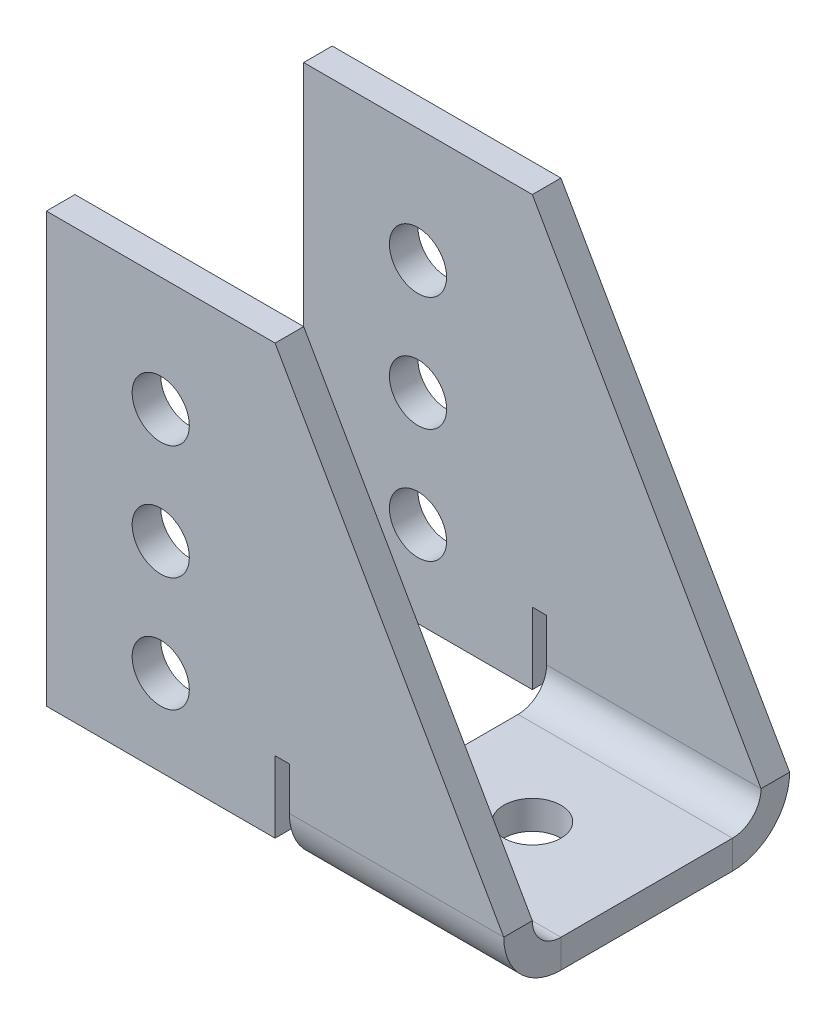
ISO-10303-21;
HEADER;
FILE_DESCRIPTION(('STEP AP214'),'2;1');
FILE_NAME('part.step','',(''),(''),'','','');
FILE_SCHEMA(('AUTOMOTIVE_DESIGN { 1 0 10303 214 1 1 1 1 }'));
ENDSEC;
DATA;
#1=APPLICATION_CONTEXT('core data for automotive mechanical design processes');
#2=APPLICATION_PROTOCOL_DEFINITION('international standard','automotive_design',2000,#1);
#3=PRODUCT_CONTEXT('',#1,'mechanical');
#4=PRODUCT('Part','Part','',(#3));
#5=PRODUCT_RELATED_PRODUCT_CATEGORY('part','',(#4));
#6=PRODUCT_DEFINITION_FORMATION('','',#4);
#7=PRODUCT_DEFINITION_CONTEXT('part definition',#1,'design');
#8=PRODUCT_DEFINITION('design','',#6,#7);
#9=PRODUCT_DEFINITION_SHAPE('','',#8);
#10=(LENGTH_UNIT() NAMED_UNIT(*) SI_UNIT(.MILLI.,.METRE.));
#11=(NAMED_UNIT(*) PLANE_ANGLE_UNIT() SI_UNIT($,.RADIAN.));
#12=(NAMED_UNIT(*) SI_UNIT($,.STERADIAN.) SOLID_ANGLE_UNIT());
#13=UNCERTAINTY_MEASURE_WITH_UNIT(LENGTH_MEASURE(1.E-05),#10,'distance_accuracy_value','');
#14=(GEOMETRIC_REPRESENTATION_CONTEXT(3) GLOBAL_UNCERTAINTY_ASSIGNED_CONTEXT((#13)) GLOBAL_UNIT_ASSIGNED_CONTEXT((#10,
#11,#12)) REPRESENTATION_CONTEXT('',''));
#15=CARTESIAN_POINT('',(0.,0.,0.));
#16=DIRECTION('',(0.,0.,1.));
#17=DIRECTION('',(1.,0.,0.));
#18=AXIS2_PLACEMENT_3D('',#15,#16,#17);
#19=CARTESIAN_POINT('',(50.8,3.175,-25.8868164850226));
#20=DIRECTION('',(1.,0.,0.));
#21=DIRECTION('',(0.,0.,1.));
#22=AXIS2_PLACEMENT_3D('',#19,#20,#21);
#23=PLANE('',#22);
#24=DIRECTION('',(0.,1.,0.));
#25=VECTOR('',#24,1.);
#26=CARTESIAN_POINT('',(50.8,3.175,-3.6618164850226));
#27=LINE('',#26,#25);
#28=CARTESIAN_POINT('',(50.8,0.,-3.6618164850226));
#29=VERTEX_POINT('',#28);
#30=CARTESIAN_POINT('',(50.8,3.175,-3.6618164850226));
#31=VERTEX_POINT('',#30);
#32=EDGE_CURVE('E12',#29,#31,#27,.T.);
#33=ORIENTED_EDGE('',*,*,#32,.F.);
#34=DIRECTION('',(0.,0.,-1.));
#35=VECTOR('',#34,1.);
#36=CARTESIAN_POINT('',(50.8,0.,-25.8868164850226));
#37=LINE('',#36,#35);
#38=CARTESIAN_POINT('',(50.8,0.,-22.7118164850226));
#39=VERTEX_POINT('',#38);
#40=EDGE_CURVE('E158',#39,#29,#37,.F.);
#41=ORIENTED_EDGE('',*,*,#40,.F.);
#42=DIRECTION('',(0.,1.,0.));
#43=VECTOR('',#42,1.);
#44=CARTESIAN_POINT('',(50.8,3.175,-22.7118164850226));
#45=LINE('',#44,#43);
#46=CARTESIAN_POINT('',(50.8,3.175,-22.7118164850226));
#47=VERTEX_POINT('',#46);
#48=EDGE_CURVE('E62',#39,#47,#45,.T.);
#49=ORIENTED_EDGE('',*,*,#48,.T.);
#50=DIRECTION('',(0.,0.,1.));
#51=VECTOR('',#50,1.);
#52=CARTESIAN_POINT('',(50.8,3.175,-25.8868164850226));
#53=LINE('',#52,#51);
#54=EDGE_CURVE('E160',#47,#31,#53,.T.);
#55=ORIENTED_EDGE('',*,*,#54,.T.);
#56=EDGE_LOOP('',(#33,#41,#49,#55));
#57=FACE_BOUND('',#56,.T.);
#58=ADVANCED_FACE('F52',(#57),#23,.T.);
#59=CARTESIAN_POINT('',(50.8,6.35,-22.7118164850226));
#60=DIRECTION('',(-1.,0.,0.));
#61=DIRECTION('',(0.,0.,1.));
#62=AXIS2_PLACEMENT_3D('',#59,#60,#61);
#63=PLANE('',#62);
#64=ORIENTED_EDGE('',*,*,#48,.F.);
#65=CARTESIAN_POINT('',(50.8,6.35,-22.7118164850226));
#66=DIRECTION('',(-1.,0.,0.));
#67=DIRECTION('',(0.,0.,1.));
#68=AXIS2_PLACEMENT_3D('',#65,#66,#67);
#69=CIRCLE('',#68,6.35);
#70=CARTESIAN_POINT('',(50.8,6.35,-29.0618164850226));
#71=VERTEX_POINT('',#70);
#72=EDGE_CURVE('E208',#39,#71,#69,.F.);
#73=ORIENTED_EDGE('',*,*,#72,.T.);
#74=DIRECTION('',(0.,0.,1.));
#75=VECTOR('',#74,1.);
#76=CARTESIAN_POINT('',(50.8,6.35,-25.8868164850226));
#77=LINE('',#76,#75);
#78=CARTESIAN_POINT('',(50.8,6.35,-25.8868164850226));
#79=VERTEX_POINT('',#78);
#80=EDGE_CURVE('E484',#71,#79,#77,.T.);
#81=ORIENTED_EDGE('',*,*,#80,.T.);
#82=CARTESIAN_POINT('',(50.8,6.35,-22.7118164850226));
#83=DIRECTION('',(1.,0.,0.));
#84=DIRECTION('',(0.,0.,-1.));
#85=AXIS2_PLACEMENT_3D('',#82,#83,#84);
#86=CIRCLE('',#85,3.175);
#87=EDGE_CURVE('E407',#47,#79,#86,.T.);
#88=ORIENTED_EDGE('',*,*,#87,.F.);
#89=EDGE_LOOP('',(#64,#73,#81,#88));
#90=FACE_BOUND('',#89,.T.);
#91=ADVANCED_FACE('F482',(#90),#63,.F.);
#92=CARTESIAN_POINT('',(41.0307692307692,23.4461538461538,-25.8868164850226));
#93=DIRECTION('',(0.868243142124459,0.496138938356834,0.));
#94=DIRECTION('',(0.496138938356834,-0.868243142124459,0.));
#95=AXIS2_PLACEMENT_3D('',#92,#93,#94);
#96=PLANE('',#95);
#97=ORIENTED_EDGE('',*,*,#80,.F.);
#98=DIRECTION('',(0.496138938356834,-0.868243142124459,0.));
#99=VECTOR('',#98,1.);
#100=CARTESIAN_POINT('',(41.0307692307692,23.4461538461538,-29.0618164850226));
#101=LINE('',#100,#99);
#102=CARTESIAN_POINT('',(25.4,50.8,-29.0618164850226));
#103=VERTEX_POINT('',#102);
#104=EDGE_CURVE('E465',#103,#71,#101,.T.);
#105=ORIENTED_EDGE('',*,*,#104,.F.);
#106=DIRECTION('',(0.,0.,1.));
#107=VECTOR('',#106,1.);
#108=CARTESIAN_POINT('',(25.4,50.8,-25.8868164850226));
#109=LINE('',#108,#107);
#110=CARTESIAN_POINT('',(25.4,50.8,-25.8868164850226));
#111=VERTEX_POINT('',#110);
#112=EDGE_CURVE('E499',#103,#111,#109,.T.);
#113=ORIENTED_EDGE('',*,*,#112,.T.);
#114=DIRECTION('',(0.496138938356834,-0.868243142124459,0.));
#115=VECTOR('',#114,1.);
#116=CARTESIAN_POINT('',(41.0307692307692,23.4461538461538,-25.8868164850226));
#117=LINE('',#116,#115);
#118=EDGE_CURVE('E501',#111,#79,#117,.T.);
#119=ORIENTED_EDGE('',*,*,#118,.T.);
#120=EDGE_LOOP('',(#97,#105,#113,#119));
#121=FACE_BOUND('',#120,.T.);
#122=ADVANCED_FACE('F496',(#121),#96,.T.);
#123=CARTESIAN_POINT('',(0.,50.8,-25.8868164850226));
#124=DIRECTION('',(0.,1.,0.));
#125=DIRECTION('',(1.,0.,0.));
#126=AXIS2_PLACEMENT_3D('',#123,#124,#125);
#127=PLANE('',#126);
#128=ORIENTED_EDGE('',*,*,#112,.F.);
#129=DIRECTION('',(1.,0.,0.));
#130=VECTOR('',#129,1.);
#131=CARTESIAN_POINT('',(0.,50.8,-29.0618164850226));
#132=LINE('',#131,#130);
#133=CARTESIAN_POINT('',(0.,50.8,-29.0618164850226));
#134=VERTEX_POINT('',#133);
#135=EDGE_CURVE('E470',#134,#103,#132,.T.);
#136=ORIENTED_EDGE('',*,*,#135,.F.);
#137=DIRECTION('',(0.,0.,1.));
#138=VECTOR('',#137,1.);
#139=CARTESIAN_POINT('',(0.,50.8,-25.8868164850226));
#140=LINE('',#139,#138);
#141=CARTESIAN_POINT('',(0.,50.8,-25.8868164850226));
#142=VERTEX_POINT('',#141);
#143=EDGE_CURVE('E504',#134,#142,#140,.T.);
#144=ORIENTED_EDGE('',*,*,#143,.T.);
#145=DIRECTION('',(1.,0.,0.));
#146=VECTOR('',#145,1.);
#147=CARTESIAN_POINT('',(0.,50.8,-25.8868164850226));
#148=LINE('',#147,#146);
#149=EDGE_CURVE('E655',#142,#111,#148,.T.);
#150=ORIENTED_EDGE('',*,*,#149,.T.);
#151=EDGE_LOOP('',(#128,#136,#144,#150));
#152=FACE_BOUND('',#151,.T.);
#153=ADVANCED_FACE('F671',(#152),#127,.T.);
#154=CARTESIAN_POINT('',(0.,0.,-25.8868164850226));
#155=DIRECTION('',(-1.,0.,0.));
#156=DIRECTION('',(0.,1.,0.));
#157=AXIS2_PLACEMENT_3D('',#154,#155,#156);
#158=PLANE('',#157);
#159=ORIENTED_EDGE('',*,*,#143,.F.);
#160=DIRECTION('',(0.,-1.,0.));
#161=VECTOR('',#160,1.);
#162=CARTESIAN_POINT('',(0.,0.,-29.0618164850226));
#163=LINE('',#162,#161);
#164=CARTESIAN_POINT('',(0.,3.175,-29.0618164850226));
#165=VERTEX_POINT('',#164);
#166=EDGE_CURVE('E466',#165,#134,#163,.F.);
#167=ORIENTED_EDGE('',*,*,#166,.F.);
#168=DIRECTION('',(0.,0.,1.));
#169=VECTOR('',#168,1.);
#170=CARTESIAN_POINT('',(0.,3.175,-25.8868164850226));
#171=LINE('',#170,#169);
#172=CARTESIAN_POINT('',(0.,3.175,-25.8868164850226));
#173=VERTEX_POINT('',#172);
#174=EDGE_CURVE('E509',#165,#173,#171,.T.);
#175=ORIENTED_EDGE('',*,*,#174,.T.);
#176=DIRECTION('',(0.,1.,0.));
#177=VECTOR('',#176,1.);
#178=CARTESIAN_POINT('',(0.,0.,-25.8868164850226));
#179=LINE('',#178,#177);
#180=EDGE_CURVE('E315',#173,#142,#179,.T.);
#181=ORIENTED_EDGE('',*,*,#180,.T.);
#182=EDGE_LOOP('',(#159,#167,#175,#181));
#183=FACE_BOUND('',#182,.T.);
#184=ADVANCED_FACE('F669',(#183),#158,.T.);
#185=CARTESIAN_POINT('',(0.,3.175,-25.8868164850226));
#186=DIRECTION('',(0.,-1.,0.));
#187=DIRECTION('',(-1.,0.,0.));
#188=AXIS2_PLACEMENT_3D('',#185,#186,#187);
#189=PLANE('',#188);
#190=ORIENTED_EDGE('',*,*,#174,.F.);
#191=DIRECTION('',(1.,0.,0.));
#192=VECTOR('',#191,1.);
#193=CARTESIAN_POINT('',(0.,3.175,-29.0618164850226));
#194=LINE('',#193,#192);
#195=CARTESIAN_POINT('',(25.4,3.175,-29.0618164850226));
#196=VERTEX_POINT('',#195);
#197=EDGE_CURVE('E461',#196,#165,#194,.F.);
#198=ORIENTED_EDGE('',*,*,#197,.F.);
#199=DIRECTION('',(0.,0.,1.));
#200=VECTOR('',#199,1.);
#201=CARTESIAN_POINT('',(25.4,3.175,-25.8868164850226));
#202=LINE('',#201,#200);
#203=CARTESIAN_POINT('',(25.4,3.175,-25.8868164850226));
#204=VERTEX_POINT('',#203);
#205=EDGE_CURVE('E512',#196,#204,#202,.T.);
#206=ORIENTED_EDGE('',*,*,#205,.T.);
#207=DIRECTION('',(-1.,0.,0.));
#208=VECTOR('',#207,1.);
#209=CARTESIAN_POINT('',(0.,3.175,-25.8868164850226));
#210=LINE('',#209,#208);
#211=EDGE_CURVE('E646',#204,#173,#210,.T.);
#212=ORIENTED_EDGE('',*,*,#211,.T.);
#213=EDGE_LOOP('',(#190,#198,#206,#212));
#214=FACE_BOUND('',#213,.T.);
#215=ADVANCED_FACE('F645',(#214),#189,.T.);
#216=CARTESIAN_POINT('',(25.4,0.,-25.8868164850226));
#217=DIRECTION('',(-1.,0.,0.));
#218=DIRECTION('',(0.,1.,0.));
#219=AXIS2_PLACEMENT_3D('',#216,#217,#218);
#220=PLANE('',#219);
#221=ORIENTED_EDGE('',*,*,#205,.F.);
#222=DIRECTION('',(0.,-1.,0.));
#223=VECTOR('',#222,1.);
#224=CARTESIAN_POINT('',(25.4,0.,-29.0618164850226));
#225=LINE('',#224,#223);
#226=CARTESIAN_POINT('',(25.4,11.1125,-29.0618164850226));
#227=VERTEX_POINT('',#226);
#228=EDGE_CURVE('E425',#196,#227,#225,.F.);
#229=ORIENTED_EDGE('',*,*,#228,.T.);
#230=DIRECTION('',(0.,0.,1.));
#231=VECTOR('',#230,1.);
#232=CARTESIAN_POINT('',(25.4,11.1125,-25.8868164850226));
#233=LINE('',#232,#231);
#234=CARTESIAN_POINT('',(25.4,11.1125,-25.8868164850226));
#235=VERTEX_POINT('',#234);
#236=EDGE_CURVE('E515',#227,#235,#233,.T.);
#237=ORIENTED_EDGE('',*,*,#236,.T.);
#238=DIRECTION('',(0.,1.,0.));
#239=VECTOR('',#238,1.);
#240=CARTESIAN_POINT('',(25.4,0.,-25.8868164850226));
#241=LINE('',#240,#239);
#242=EDGE_CURVE('E360',#204,#235,#241,.T.);
#243=ORIENTED_EDGE('',*,*,#242,.F.);
#244=EDGE_LOOP('',(#221,#229,#237,#243));
#245=FACE_BOUND('',#244,.T.);
#246=ADVANCED_FACE('F640',(#245),#220,.F.);
#247=CARTESIAN_POINT('',(0.,11.1125,-25.8868164850226));
#248=DIRECTION('',(0.,1.,0.));
#249=DIRECTION('',(1.,0.,0.));
#250=AXIS2_PLACEMENT_3D('',#247,#248,#249);
#251=PLANE('',#250);
#252=ORIENTED_EDGE('',*,*,#236,.F.);
#253=DIRECTION('',(1.,0.,0.));
#254=VECTOR('',#253,1.);
#255=CARTESIAN_POINT('',(0.,11.1125,-29.0618164850226));
#256=LINE('',#255,#254);
#257=CARTESIAN_POINT('',(26.9875,11.1125,-29.0618164850226));
#258=VERTEX_POINT('',#257);
#259=EDGE_CURVE('E454',#227,#258,#256,.T.);
#260=ORIENTED_EDGE('',*,*,#259,.T.);
#261=DIRECTION('',(0.,0.,1.));
#262=VECTOR('',#261,1.);
#263=CARTESIAN_POINT('',(26.9875,11.1125,-25.8868164850226));
#264=LINE('',#263,#262);
#265=CARTESIAN_POINT('',(26.9875,11.1125,-25.8868164850226));
#266=VERTEX_POINT('',#265);
#267=EDGE_CURVE('E518',#258,#266,#264,.T.);
#268=ORIENTED_EDGE('',*,*,#267,.T.);
#269=DIRECTION('',(1.,0.,0.));
#270=VECTOR('',#269,1.);
#271=CARTESIAN_POINT('',(0.,11.1125,-25.8868164850226));
#272=LINE('',#271,#270);
#273=EDGE_CURVE('E364',#235,#266,#272,.T.);
#274=ORIENTED_EDGE('',*,*,#273,.F.);
#275=EDGE_LOOP('',(#252,#260,#268,#274));
#276=FACE_BOUND('',#275,.T.);
#277=ADVANCED_FACE('F635',(#276),#251,.F.);
#278=CARTESIAN_POINT('',(26.9875,0.,-25.8868164850226));
#279=DIRECTION('',(1.,0.,0.));
#280=DIRECTION('',(0.,-1.,0.));
#281=AXIS2_PLACEMENT_3D('',#278,#279,#280);
#282=PLANE('',#281);
#283=ORIENTED_EDGE('',*,*,#267,.F.);
#284=DIRECTION('',(0.,-1.,0.));
#285=VECTOR('',#284,1.);
#286=CARTESIAN_POINT('',(26.9875,0.,-29.0618164850226));
#287=LINE('',#286,#285);
#288=CARTESIAN_POINT('',(26.9875,6.35,-29.0618164850226));
#289=VERTEX_POINT('',#288);
#290=EDGE_CURVE('E445',#258,#289,#287,.T.);
#291=ORIENTED_EDGE('',*,*,#290,.T.);
#292=DIRECTION('',(0.,0.,1.));
#293=VECTOR('',#292,1.);
#294=CARTESIAN_POINT('',(26.9875,6.35,-25.8868164850226));
#295=LINE('',#294,#293);
#296=CARTESIAN_POINT('',(26.9875,6.35,-25.8868164850226));
#297=VERTEX_POINT('',#296);
#298=EDGE_CURVE('E521',#289,#297,#295,.T.);
#299=ORIENTED_EDGE('',*,*,#298,.T.);
#300=DIRECTION('',(0.,-1.,0.));
#301=VECTOR('',#300,1.);
#302=CARTESIAN_POINT('',(26.9875,0.,-25.8868164850226));
#303=LINE('',#302,#301);
#304=EDGE_CURVE('E368',#266,#297,#303,.T.);
#305=ORIENTED_EDGE('',*,*,#304,.F.);
#306=EDGE_LOOP('',(#283,#291,#299,#305));
#307=FACE_BOUND('',#306,.T.);
#308=ADVANCED_FACE('F596',(#307),#282,.F.);
#309=CARTESIAN_POINT('',(26.9875,6.35,-22.7118164850226));
#310=DIRECTION('',(-1.,0.,0.));
#311=DIRECTION('',(0.,-1.,0.));
#312=AXIS2_PLACEMENT_3D('',#309,#310,#311);
#313=PLANE('',#312);
#314=ORIENTED_EDGE('',*,*,#298,.F.);
#315=CARTESIAN_POINT('',(26.9875,6.35,-22.7118164850226));
#316=DIRECTION('',(-1.,0.,0.));
#317=DIRECTION('',(0.,0.,1.));
#318=AXIS2_PLACEMENT_3D('',#315,#316,#317);
#319=CIRCLE('',#318,6.35);
#320=CARTESIAN_POINT('',(26.9875,0.,-22.7118164850226));
#321=VERTEX_POINT('',#320);
#322=EDGE_CURVE('E198',#289,#321,#319,.T.);
#323=ORIENTED_EDGE('',*,*,#322,.T.);
#324=DIRECTION('',(0.,1.,0.));
#325=VECTOR('',#324,1.);
#326=CARTESIAN_POINT('',(26.9875,3.175,-22.7118164850226));
#327=LINE('',#326,#325);
#328=CARTESIAN_POINT('',(26.9875,3.175,-22.7118164850226));
#329=VERTEX_POINT('',#328);
#330=EDGE_CURVE('E524',#321,#329,#327,.T.);
#331=ORIENTED_EDGE('',*,*,#330,.T.);
#332=CARTESIAN_POINT('',(26.9875,6.35,-22.7118164850226));
#333=DIRECTION('',(1.,0.,0.));
#334=DIRECTION('',(0.,1.,0.));
#335=AXIS2_PLACEMENT_3D('',#332,#333,#334);
#336=CIRCLE('',#335,3.175);
#337=EDGE_CURVE('E395',#297,#329,#336,.F.);
#338=ORIENTED_EDGE('',*,*,#337,.F.);
#339=EDGE_LOOP('',(#314,#323,#331,#338));
#340=FACE_BOUND('',#339,.T.);
#341=ADVANCED_FACE('F603',(#340),#313,.T.);
#342=CARTESIAN_POINT('',(26.9875,3.175,-25.8868164850226));
#343=DIRECTION('',(1.,0.,0.));
#344=DIRECTION('',(0.,0.,1.));
#345=AXIS2_PLACEMENT_3D('',#342,#343,#344);
#346=PLANE('',#345);
#347=ORIENTED_EDGE('',*,*,#330,.F.);
#348=DIRECTION('',(0.,0.,-1.));
#349=VECTOR('',#348,1.);
#350=CARTESIAN_POINT('',(26.9875,0.,-25.8868164850226));
#351=LINE('',#350,#349);
#352=CARTESIAN_POINT('',(26.9875,0.,-3.6618164850226));
#353=VERTEX_POINT('',#352);
#354=EDGE_CURVE('E190',#321,#353,#351,.F.);
#355=ORIENTED_EDGE('',*,*,#354,.T.);
#356=DIRECTION('',(0.,1.,0.));
#357=VECTOR('',#356,1.);
#358=CARTESIAN_POINT('',(26.9875,3.175,-3.6618164850226));
#359=LINE('',#358,#357);
#360=CARTESIAN_POINT('',(26.9875,3.175,-3.6618164850226));
#361=VERTEX_POINT('',#360);
#362=EDGE_CURVE('E526',#353,#361,#359,.T.);
#363=ORIENTED_EDGE('',*,*,#362,.T.);
#364=DIRECTION('',(0.,0.,1.));
#365=VECTOR('',#364,1.);
#366=CARTESIAN_POINT('',(26.9875,3.175,-25.8868164850226));
#367=LINE('',#366,#365);
#368=EDGE_CURVE('E329',#329,#361,#367,.T.);
#369=ORIENTED_EDGE('',*,*,#368,.F.);
#370=EDGE_LOOP('',(#347,#355,#363,#369));
#371=FACE_BOUND('',#370,.T.);
#372=ADVANCED_FACE('F1705',(#371),#346,.F.);
#373=CARTESIAN_POINT('',(26.9875,6.35,-3.6618164850226));
#374=DIRECTION('',(-1.,0.,0.));
#375=DIRECTION('',(0.,-1.,0.));
#376=AXIS2_PLACEMENT_3D('',#373,#374,#375);
#377=PLANE('',#376);
#378=ORIENTED_EDGE('',*,*,#362,.F.);
#379=CARTESIAN_POINT('',(26.9875,6.35,-3.6618164850226));
#380=DIRECTION('',(-1.,0.,0.));
#381=DIRECTION('',(0.,0.,1.));
#382=AXIS2_PLACEMENT_3D('',#379,#380,#381);
#383=CIRCLE('',#382,6.35);
#384=CARTESIAN_POINT('',(26.9875,6.35,2.6881835149774));
#385=VERTEX_POINT('',#384);
#386=EDGE_CURVE('E176',#353,#385,#383,.T.);
#387=ORIENTED_EDGE('',*,*,#386,.T.);
#388=DIRECTION('',(0.,0.,-1.));
#389=VECTOR('',#388,1.);
#390=CARTESIAN_POINT('',(26.9875,6.35,-0.486816485022599));
#391=LINE('',#390,#389);
#392=CARTESIAN_POINT('',(26.9875,6.35,-0.486816485022599));
#393=VERTEX_POINT('',#392);
#394=EDGE_CURVE('E529',#385,#393,#391,.T.);
#395=ORIENTED_EDGE('',*,*,#394,.T.);
#396=CARTESIAN_POINT('',(26.9875,6.35,-3.6618164850226));
#397=DIRECTION('',(1.,0.,0.));
#398=DIRECTION('',(0.,1.,0.));
#399=AXIS2_PLACEMENT_3D('',#396,#397,#398);
#400=CIRCLE('',#399,3.175);
#401=EDGE_CURVE('E394',#361,#393,#400,.F.);
#402=ORIENTED_EDGE('',*,*,#401,.F.);
#403=EDGE_LOOP('',(#378,#387,#395,#402));
#404=FACE_BOUND('',#403,.T.);
#405=ADVANCED_FACE('F1702',(#404),#377,.T.);
#406=CARTESIAN_POINT('',(26.9875,0.,-0.486816485022599));
#407=DIRECTION('',(1.,0.,0.));
#408=DIRECTION('',(0.,1.,0.));
#409=AXIS2_PLACEMENT_3D('',#406,#407,#408);
#410=PLANE('',#409);
#411=ORIENTED_EDGE('',*,*,#394,.F.);
#412=DIRECTION('',(0.,1.,0.));
#413=VECTOR('',#412,1.);
#414=CARTESIAN_POINT('',(26.9875,0.,2.6881835149774));
#415=LINE('',#414,#413);
#416=CARTESIAN_POINT('',(26.9875,11.1125,2.6881835149774));
#417=VERTEX_POINT('',#416);
#418=EDGE_CURVE('E182',#385,#417,#415,.T.);
#419=ORIENTED_EDGE('',*,*,#418,.T.);
#420=DIRECTION('',(0.,0.,-1.));
#421=VECTOR('',#420,1.);
#422=CARTESIAN_POINT('',(26.9875,11.1125,-0.486816485022599));
#423=LINE('',#422,#421);
#424=CARTESIAN_POINT('',(26.9875,11.1125,-0.486816485022599));
#425=VERTEX_POINT('',#424);
#426=EDGE_CURVE('E532',#417,#425,#423,.T.);
#427=ORIENTED_EDGE('',*,*,#426,.T.);
#428=DIRECTION('',(0.,1.,0.));
#429=VECTOR('',#428,1.);
#430=CARTESIAN_POINT('',(26.9875,0.,-0.486816485022599));
#431=LINE('',#430,#429);
#432=EDGE_CURVE('E380',#393,#425,#431,.T.);
#433=ORIENTED_EDGE('',*,*,#432,.F.);
#434=EDGE_LOOP('',(#411,#419,#427,#433));
#435=FACE_BOUND('',#434,.T.);
#436=ADVANCED_FACE('F574',(#435),#410,.F.);
#437=CARTESIAN_POINT('',(0.,11.1125,-0.486816485022599));
#438=DIRECTION('',(0.,1.,0.));
#439=DIRECTION('',(-1.,0.,0.));
#440=AXIS2_PLACEMENT_3D('',#437,#438,#439);
#441=PLANE('',#440);
#442=ORIENTED_EDGE('',*,*,#426,.F.);
#443=DIRECTION('',(1.,0.,0.));
#444=VECTOR('',#443,1.);
#445=CARTESIAN_POINT('',(0.,11.1125,2.6881835149774));
#446=LINE('',#445,#444);
#447=CARTESIAN_POINT('',(25.4,11.1125,2.6881835149774));
#448=VERTEX_POINT('',#447);
#449=EDGE_CURVE('E441',#417,#448,#446,.F.);
#450=ORIENTED_EDGE('',*,*,#449,.T.);
#451=DIRECTION('',(0.,0.,-1.));
#452=VECTOR('',#451,1.);
#453=CARTESIAN_POINT('',(25.4,11.1125,-0.486816485022599));
#454=LINE('',#453,#452);
#455=CARTESIAN_POINT('',(25.4,11.1125,-0.486816485022599));
#456=VERTEX_POINT('',#455);
#457=EDGE_CURVE('E535',#448,#456,#454,.T.);
#458=ORIENTED_EDGE('',*,*,#457,.T.);
#459=DIRECTION('',(-1.,0.,0.));
#460=VECTOR('',#459,1.);
#461=CARTESIAN_POINT('',(0.,11.1125,-0.486816485022599));
#462=LINE('',#461,#460);
#463=EDGE_CURVE('E372',#425,#456,#462,.T.);
#464=ORIENTED_EDGE('',*,*,#463,.F.);
#465=EDGE_LOOP('',(#442,#450,#458,#464));
#466=FACE_BOUND('',#465,.T.);
#467=ADVANCED_FACE('F1695',(#466),#441,.F.);
#468=CARTESIAN_POINT('',(25.4,0.,-0.486816485022599));
#469=DIRECTION('',(-1.,0.,0.));
#470=DIRECTION('',(0.,-1.,0.));
#471=AXIS2_PLACEMENT_3D('',#468,#469,#470);
#472=PLANE('',#471);
#473=ORIENTED_EDGE('',*,*,#457,.F.);
#474=DIRECTION('',(0.,1.,0.));
#475=VECTOR('',#474,1.);
#476=CARTESIAN_POINT('',(25.4,0.,2.6881835149774));
#477=LINE('',#476,#475);
#478=CARTESIAN_POINT('',(25.4,3.175,2.6881835149774));
#479=VERTEX_POINT('',#478);
#480=EDGE_CURVE('E437',#448,#479,#477,.F.);
#481=ORIENTED_EDGE('',*,*,#480,.T.);
#482=DIRECTION('',(0.,0.,-1.));
#483=VECTOR('',#482,1.);
#484=CARTESIAN_POINT('',(25.4,3.175,-0.486816485022599));
#485=LINE('',#484,#483);
#486=CARTESIAN_POINT('',(25.4,3.175,-0.486816485022599));
#487=VERTEX_POINT('',#486);
#488=EDGE_CURVE('E538',#479,#487,#485,.T.);
#489=ORIENTED_EDGE('',*,*,#488,.T.);
#490=DIRECTION('',(0.,-1.,0.));
#491=VECTOR('',#490,1.);
#492=CARTESIAN_POINT('',(25.4,0.,-0.486816485022599));
#493=LINE('',#492,#491);
#494=EDGE_CURVE('E376',#456,#487,#493,.T.);
#495=ORIENTED_EDGE('',*,*,#494,.F.);
#496=EDGE_LOOP('',(#473,#481,#489,#495));
#497=FACE_BOUND('',#496,.T.);
#498=ADVANCED_FACE('F1691',(#497),#472,.F.);
#499=CARTESIAN_POINT('',(0.,3.175,-0.486816485022599));
#500=DIRECTION('',(0.,-1.,0.));
#501=DIRECTION('',(1.,0.,0.));
#502=AXIS2_PLACEMENT_3D('',#499,#500,#501);
#503=PLANE('',#502);
#504=ORIENTED_EDGE('',*,*,#488,.F.);
#505=DIRECTION('',(1.,0.,0.));
#506=VECTOR('',#505,1.);
#507=CARTESIAN_POINT('',(0.,3.175,2.6881835149774));
#508=LINE('',#507,#506);
#509=CARTESIAN_POINT('',(0.,3.175,2.6881835149774));
#510=VERTEX_POINT('',#509);
#511=EDGE_CURVE('E287',#510,#479,#508,.T.);
#512=ORIENTED_EDGE('',*,*,#511,.F.);
#513=DIRECTION('',(0.,0.,-1.));
#514=VECTOR('',#513,1.);
#515=CARTESIAN_POINT('',(0.,3.175,-0.486816485022599));
#516=LINE('',#515,#514);
#517=CARTESIAN_POINT('',(0.,3.175,-0.486816485022599));
#518=VERTEX_POINT('',#517);
#519=EDGE_CURVE('E541',#510,#518,#516,.T.);
#520=ORIENTED_EDGE('',*,*,#519,.T.);
#521=DIRECTION('',(1.,0.,0.));
#522=VECTOR('',#521,1.);
#523=CARTESIAN_POINT('',(0.,3.175,-0.486816485022599));
#524=LINE('',#523,#522);
#525=EDGE_CURVE('E345',#518,#487,#524,.T.);
#526=ORIENTED_EDGE('',*,*,#525,.T.);
#527=EDGE_LOOP('',(#504,#512,#520,#526));
#528=FACE_BOUND('',#527,.T.);
#529=ADVANCED_FACE('F1687',(#528),#503,.T.);
#530=CARTESIAN_POINT('',(0.,0.,-0.486816485022599));
#531=DIRECTION('',(1.,0.,0.));
#532=DIRECTION('',(0.,1.,0.));
#533=AXIS2_PLACEMENT_3D('',#530,#531,#532);
#534=PLANE('',#533);
#535=ORIENTED_EDGE('',*,*,#519,.F.);
#536=DIRECTION('',(0.,1.,0.));
#537=VECTOR('',#536,1.);
#538=CARTESIAN_POINT('',(0.,0.,2.6881835149774));
#539=LINE('',#538,#537);
#540=CARTESIAN_POINT('',(0.,50.8,2.6881835149774));
#541=VERTEX_POINT('',#540);
#542=EDGE_CURVE('E430',#510,#541,#539,.T.);
#543=ORIENTED_EDGE('',*,*,#542,.T.);
#544=DIRECTION('',(0.,0.,-1.));
#545=VECTOR('',#544,1.);
#546=CARTESIAN_POINT('',(0.,50.8,-0.486816485022599));
#547=LINE('',#546,#545);
#548=CARTESIAN_POINT('',(0.,50.8,-0.486816485022599));
#549=VERTEX_POINT('',#548);
#550=EDGE_CURVE('E544',#541,#549,#547,.T.);
#551=ORIENTED_EDGE('',*,*,#550,.T.);
#552=DIRECTION('',(0.,1.,0.));
#553=VECTOR('',#552,1.);
#554=CARTESIAN_POINT('',(0.,0.,-0.486816485022599));
#555=LINE('',#554,#553);
#556=EDGE_CURVE('E349',#518,#549,#555,.T.);
#557=ORIENTED_EDGE('',*,*,#556,.F.);
#558=EDGE_LOOP('',(#535,#543,#551,#557));
#559=FACE_BOUND('',#558,.T.);
#560=ADVANCED_FACE('F1684',(#559),#534,.F.);
#561=CARTESIAN_POINT('',(0.,50.8,-0.486816485022599));
#562=DIRECTION('',(0.,-1.,0.));
#563=DIRECTION('',(1.,0.,0.));
#564=AXIS2_PLACEMENT_3D('',#561,#562,#563);
#565=PLANE('',#564);
#566=ORIENTED_EDGE('',*,*,#550,.F.);
#567=DIRECTION('',(1.,0.,0.));
#568=VECTOR('',#567,1.);
#569=CARTESIAN_POINT('',(0.,50.8,2.6881835149774));
#570=LINE('',#569,#568);
#571=CARTESIAN_POINT('',(25.4,50.8,2.6881835149774));
#572=VERTEX_POINT('',#571);
#573=EDGE_CURVE('E426',#541,#572,#570,.T.);
#574=ORIENTED_EDGE('',*,*,#573,.T.);
#575=DIRECTION('',(0.,0.,-1.));
#576=VECTOR('',#575,1.);
#577=CARTESIAN_POINT('',(25.4,50.8,-0.486816485022599));
#578=LINE('',#577,#576);
#579=CARTESIAN_POINT('',(25.4,50.8,-0.486816485022599));
#580=VERTEX_POINT('',#579);
#581=EDGE_CURVE('E546',#572,#580,#578,.T.);
#582=ORIENTED_EDGE('',*,*,#581,.T.);
#583=DIRECTION('',(1.,0.,0.));
#584=VECTOR('',#583,1.);
#585=CARTESIAN_POINT('',(0.,50.8,-0.486816485022599));
#586=LINE('',#585,#584);
#587=EDGE_CURVE('E352',#549,#580,#586,.T.);
#588=ORIENTED_EDGE('',*,*,#587,.F.);
#589=EDGE_LOOP('',(#566,#574,#582,#588));
#590=FACE_BOUND('',#589,.T.);
#591=ADVANCED_FACE('F1681',(#590),#565,.F.);
#592=CARTESIAN_POINT('',(41.0307692307692,23.4461538461538,-0.486816485022599));
#593=DIRECTION('',(-0.868243142124459,-0.496138938356834,0.));
#594=DIRECTION('',(0.496138938356834,-0.868243142124459,0.));
#595=AXIS2_PLACEMENT_3D('',#592,#593,#594);
#596=PLANE('',#595);
#597=ORIENTED_EDGE('',*,*,#581,.F.);
#598=DIRECTION('',(0.496138938356834,-0.868243142124459,0.));
#599=VECTOR('',#598,1.);
#600=CARTESIAN_POINT('',(41.0307692307692,23.4461538461538,2.6881835149774));
#601=LINE('',#600,#599);
#602=CARTESIAN_POINT('',(50.8,6.35,2.6881835149774));
#603=VERTEX_POINT('',#602);
#604=EDGE_CURVE('E422',#572,#603,#601,.T.);
#605=ORIENTED_EDGE('',*,*,#604,.T.);
#606=DIRECTION('',(0.,0.,-1.));
#607=VECTOR('',#606,1.);
#608=CARTESIAN_POINT('',(50.8,6.35,-0.486816485022599));
#609=LINE('',#608,#607);
#610=CARTESIAN_POINT('',(50.8,6.35,-0.486816485022599));
#611=VERTEX_POINT('',#610);
#612=EDGE_CURVE('E56',#603,#611,#609,.T.);
#613=ORIENTED_EDGE('',*,*,#612,.T.);
#614=DIRECTION('',(0.496138938356834,-0.868243142124459,0.));
#615=VECTOR('',#614,1.);
#616=CARTESIAN_POINT('',(41.0307692307692,23.4461538461538,-0.486816485022599));
#617=LINE('',#616,#615);
#618=EDGE_CURVE('E356',#580,#611,#617,.T.);
#619=ORIENTED_EDGE('',*,*,#618,.F.);
#620=EDGE_LOOP('',(#597,#605,#613,#619));
#621=FACE_BOUND('',#620,.T.);
#622=ADVANCED_FACE('F554',(#621),#596,.F.);
#623=CARTESIAN_POINT('',(12.7,38.1,-25.8868164850226));
#624=DIRECTION('',(0.,0.,-1.));
#625=DIRECTION('',(-1.,0.,0.));
#626=AXIS2_PLACEMENT_3D('',#623,#624,#625);
#627=CYLINDRICAL_SURFACE('',#626,3.175);
#628=CARTESIAN_POINT('',(12.7,38.1,-25.8868164850226));
#629=DIRECTION('',(0.,0.,-1.));
#630=DIRECTION('',(-1.,0.,0.));
#631=AXIS2_PLACEMENT_3D('',#628,#629,#630);
#632=CIRCLE('',#631,3.175);
#633=CARTESIAN_POINT('',(9.525,38.1,-25.8868164850226));
#634=VERTEX_POINT('',#633);
#635=EDGE_CURVE('E399',#634,#634,#632,.T.);
#636=ORIENTED_EDGE('',*,*,#635,.F.);
#637=EDGE_LOOP('',(#636));
#638=FACE_BOUND('',#637,.T.);
#639=CARTESIAN_POINT('',(12.7,38.1,-29.0618164850226));
#640=DIRECTION('',(0.,0.,-1.));
#641=DIRECTION('',(-1.,0.,0.));
#642=AXIS2_PLACEMENT_3D('',#639,#640,#641);
#643=CIRCLE('',#642,3.175);
#644=CARTESIAN_POINT('',(9.525,38.1,-29.0618164850226));
#645=VERTEX_POINT('',#644);
#646=EDGE_CURVE('E204',#645,#645,#643,.T.);
#647=ORIENTED_EDGE('',*,*,#646,.T.);
#648=EDGE_LOOP('',(#647));
#649=FACE_BOUND('',#648,.T.);
#650=ADVANCED_FACE('F705',(#638,#649),#627,.F.);
#651=CARTESIAN_POINT('',(12.7,25.4,-25.8868164850226));
#652=DIRECTION('',(0.,0.,-1.));
#653=DIRECTION('',(-1.,0.,0.));
#654=AXIS2_PLACEMENT_3D('',#651,#652,#653);
#655=CYLINDRICAL_SURFACE('',#654,3.17500000000001);
#656=CARTESIAN_POINT('',(12.7,25.4,-25.8868164850226));
#657=DIRECTION('',(0.,0.,-1.));
#658=DIRECTION('',(-1.,0.,0.));
#659=AXIS2_PLACEMENT_3D('',#656,#657,#658);
#660=CIRCLE('',#659,3.17500000000001);
#661=CARTESIAN_POINT('',(9.52499999999999,25.4,-25.8868164850226));
#662=VERTEX_POINT('',#661);
#663=EDGE_CURVE('E659',#662,#662,#660,.T.);
#664=ORIENTED_EDGE('',*,*,#663,.F.);
#665=EDGE_LOOP('',(#664));
#666=FACE_BOUND('',#665,.T.);
#667=CARTESIAN_POINT('',(12.7,25.4,-29.0618164850226));
#668=DIRECTION('',(0.,0.,-1.));
#669=DIRECTION('',(-1.,0.,0.));
#670=AXIS2_PLACEMENT_3D('',#667,#668,#669);
#671=CIRCLE('',#670,3.17500000000001);
#672=CARTESIAN_POINT('',(9.52499999999999,25.4,-29.0618164850226));
#673=VERTEX_POINT('',#672);
#674=EDGE_CURVE('E255',#673,#673,#671,.T.);
#675=ORIENTED_EDGE('',*,*,#674,.T.);
#676=EDGE_LOOP('',(#675));
#677=FACE_BOUND('',#676,.T.);
#678=ADVANCED_FACE('F707',(#666,#677),#655,.F.);
#679=CARTESIAN_POINT('',(12.7,12.7,-25.8868164850226));
#680=DIRECTION('',(0.,0.,-1.));
#681=DIRECTION('',(-1.,0.,0.));
#682=AXIS2_PLACEMENT_3D('',#679,#680,#681);
#683=CYLINDRICAL_SURFACE('',#682,3.175);
#684=CARTESIAN_POINT('',(12.7,12.7,-25.8868164850226));
#685=DIRECTION('',(0.,0.,-1.));
#686=DIRECTION('',(-1.,0.,0.));
#687=AXIS2_PLACEMENT_3D('',#684,#685,#686);
#688=CIRCLE('',#687,3.175);
#689=CARTESIAN_POINT('',(9.525,12.7,-25.8868164850226));
#690=VERTEX_POINT('',#689);
#691=EDGE_CURVE('E651',#690,#690,#688,.T.);
#692=ORIENTED_EDGE('',*,*,#691,.F.);
#693=EDGE_LOOP('',(#692));
#694=FACE_BOUND('',#693,.T.);
#695=CARTESIAN_POINT('',(12.7,12.7,-29.0618164850226));
#696=DIRECTION('',(0.,0.,-1.));
#697=DIRECTION('',(-1.,0.,0.));
#698=AXIS2_PLACEMENT_3D('',#695,#696,#697);
#699=CIRCLE('',#698,3.175);
#700=CARTESIAN_POINT('',(9.525,12.7,-29.0618164850226));
#701=VERTEX_POINT('',#700);
#702=EDGE_CURVE('E259',#701,#701,#699,.T.);
#703=ORIENTED_EDGE('',*,*,#702,.T.);
#704=EDGE_LOOP('',(#703));
#705=FACE_BOUND('',#704,.T.);
#706=ADVANCED_FACE('F54',(#694,#705),#683,.F.);
#707=CARTESIAN_POINT('',(38.1,3.175,-13.1868164850226));
#708=DIRECTION('',(0.,-1.,0.));
#709=DIRECTION('',(0.,0.,-1.));
#710=AXIS2_PLACEMENT_3D('',#707,#708,#709);
#711=CYLINDRICAL_SURFACE('',#710,3.175);
#712=CARTESIAN_POINT('',(38.1,3.175,-13.1868164850226));
#713=DIRECTION('',(0.,-1.,0.));
#714=DIRECTION('',(0.,0.,-1.));
#715=AXIS2_PLACEMENT_3D('',#712,#713,#714);
#716=CIRCLE('',#715,3.175);
#717=CARTESIAN_POINT('',(38.1,3.175,-16.3618164850226));
#718=VERTEX_POINT('',#717);
#719=EDGE_CURVE('E309',#718,#718,#716,.T.);
#720=ORIENTED_EDGE('',*,*,#719,.F.);
#721=EDGE_LOOP('',(#720));
#722=FACE_BOUND('',#721,.T.);
#723=CARTESIAN_POINT('',(38.1,0.,-13.1868164850226));
#724=DIRECTION('',(0.,-1.,0.));
#725=DIRECTION('',(0.,0.,-1.));
#726=AXIS2_PLACEMENT_3D('',#723,#724,#725);
#727=CIRCLE('',#726,3.175);
#728=CARTESIAN_POINT('',(38.1,0.,-16.3618164850226));
#729=VERTEX_POINT('',#728);
#730=EDGE_CURVE('E191',#729,#729,#727,.T.);
#731=ORIENTED_EDGE('',*,*,#730,.T.);
#732=EDGE_LOOP('',(#731));
#733=FACE_BOUND('',#732,.T.);
#734=ADVANCED_FACE('F694',(#722,#733),#711,.F.);
#735=CARTESIAN_POINT('',(12.7,38.1,-0.486816485022599));
#736=DIRECTION('',(0.,0.,1.));
#737=DIRECTION('',(1.,0.,0.));
#738=AXIS2_PLACEMENT_3D('',#735,#736,#737);
#739=CYLINDRICAL_SURFACE('',#738,3.175);
#740=CARTESIAN_POINT('',(12.7,38.1,-0.486816485022599));
#741=DIRECTION('',(0.,0.,1.));
#742=DIRECTION('',(1.,0.,0.));
#743=AXIS2_PLACEMENT_3D('',#740,#741,#742);
#744=CIRCLE('',#743,3.175);
#745=CARTESIAN_POINT('',(15.875,38.1,-0.486816485022599));
#746=VERTEX_POINT('',#745);
#747=EDGE_CURVE('E333',#746,#746,#744,.T.);
#748=ORIENTED_EDGE('',*,*,#747,.F.);
#749=EDGE_LOOP('',(#748));
#750=FACE_BOUND('',#749,.T.);
#751=CARTESIAN_POINT('',(12.7,38.1,2.6881835149774));
#752=DIRECTION('',(0.,0.,1.));
#753=DIRECTION('',(1.,0.,0.));
#754=AXIS2_PLACEMENT_3D('',#751,#752,#753);
#755=CIRCLE('',#754,3.175);
#756=CARTESIAN_POINT('',(15.875,38.1,2.6881835149774));
#757=VERTEX_POINT('',#756);
#758=EDGE_CURVE('E212',#757,#757,#755,.T.);
#759=ORIENTED_EDGE('',*,*,#758,.T.);
#760=EDGE_LOOP('',(#759));
#761=FACE_BOUND('',#760,.T.);
#762=ADVANCED_FACE('F690',(#750,#761),#739,.F.);
#763=CARTESIAN_POINT('',(12.7,25.4,-0.486816485022599));
#764=DIRECTION('',(0.,0.,1.));
#765=DIRECTION('',(1.,0.,0.));
#766=AXIS2_PLACEMENT_3D('',#763,#764,#765);
#767=CYLINDRICAL_SURFACE('',#766,3.17500000000001);
#768=CARTESIAN_POINT('',(12.7,25.4,-0.486816485022599));
#769=DIRECTION('',(0.,0.,1.));
#770=DIRECTION('',(1.,0.,0.));
#771=AXIS2_PLACEMENT_3D('',#768,#769,#770);
#772=CIRCLE('',#771,3.17500000000001);
#773=CARTESIAN_POINT('',(15.875,25.4,-0.486816485022599));
#774=VERTEX_POINT('',#773);
#775=EDGE_CURVE('E337',#774,#774,#772,.T.);
#776=ORIENTED_EDGE('',*,*,#775,.F.);
#777=EDGE_LOOP('',(#776));
#778=FACE_BOUND('',#777,.T.);
#779=CARTESIAN_POINT('',(12.7,25.4,2.6881835149774));
#780=DIRECTION('',(0.,0.,1.));
#781=DIRECTION('',(1.,0.,0.));
#782=AXIS2_PLACEMENT_3D('',#779,#780,#781);
#783=CIRCLE('',#782,3.17500000000001);
#784=CARTESIAN_POINT('',(15.875,25.4,2.6881835149774));
#785=VERTEX_POINT('',#784);
#786=EDGE_CURVE('E217',#785,#785,#783,.T.);
#787=ORIENTED_EDGE('',*,*,#786,.T.);
#788=EDGE_LOOP('',(#787));
#789=FACE_BOUND('',#788,.T.);
#790=ADVANCED_FACE('F693',(#778,#789),#767,.F.);
#791=CARTESIAN_POINT('',(12.7,12.7,-0.486816485022599));
#792=DIRECTION('',(0.,0.,1.));
#793=DIRECTION('',(1.,0.,0.));
#794=AXIS2_PLACEMENT_3D('',#791,#792,#793);
#795=CYLINDRICAL_SURFACE('',#794,3.175);
#796=CARTESIAN_POINT('',(12.7,12.7,-0.486816485022599));
#797=DIRECTION('',(0.,0.,1.));
#798=DIRECTION('',(1.,0.,0.));
#799=AXIS2_PLACEMENT_3D('',#796,#797,#798);
#800=CIRCLE('',#799,3.175);
#801=CARTESIAN_POINT('',(15.875,12.7,-0.486816485022599));
#802=VERTEX_POINT('',#801);
#803=EDGE_CURVE('E341',#802,#802,#800,.T.);
#804=ORIENTED_EDGE('',*,*,#803,.F.);
#805=EDGE_LOOP('',(#804));
#806=FACE_BOUND('',#805,.T.);
#807=CARTESIAN_POINT('',(12.7,12.7,2.6881835149774));
#808=DIRECTION('',(0.,0.,1.));
#809=DIRECTION('',(1.,0.,0.));
#810=AXIS2_PLACEMENT_3D('',#807,#808,#809);
#811=CIRCLE('',#810,3.175);
#812=CARTESIAN_POINT('',(15.875,12.7,2.6881835149774));
#813=VERTEX_POINT('',#812);
#814=EDGE_CURVE('E283',#813,#813,#811,.T.);
#815=ORIENTED_EDGE('',*,*,#814,.T.);
#816=EDGE_LOOP('',(#815));
#817=FACE_BOUND('',#816,.T.);
#818=ADVANCED_FACE('F689',(#806,#817),#795,.F.);
#819=CARTESIAN_POINT('',(50.8,6.35,-3.6618164850226));
#820=DIRECTION('',(1.,0.,0.));
#821=DIRECTION('',(0.,0.,-1.));
#822=AXIS2_PLACEMENT_3D('',#819,#820,#821);
#823=PLANE('',#822);
#824=CARTESIAN_POINT('',(50.8,6.35,-3.6618164850226));
#825=DIRECTION('',(-1.,0.,0.));
#826=DIRECTION('',(0.,0.,1.));
#827=AXIS2_PLACEMENT_3D('',#824,#825,#826);
#828=CIRCLE('',#827,6.35);
#829=EDGE_CURVE('E173',#603,#29,#828,.F.);
#830=ORIENTED_EDGE('',*,*,#829,.T.);
#831=ORIENTED_EDGE('',*,*,#32,.T.);
#832=CARTESIAN_POINT('',(50.8,6.35,-3.6618164850226));
#833=DIRECTION('',(-1.,0.,0.));
#834=DIRECTION('',(0.,0.,1.));
#835=AXIS2_PLACEMENT_3D('',#832,#833,#834);
#836=CIRCLE('',#835,3.175);
#837=EDGE_CURVE('E392',#611,#31,#836,.F.);
#838=ORIENTED_EDGE('',*,*,#837,.F.);
#839=ORIENTED_EDGE('',*,*,#612,.F.);
#840=EDGE_LOOP('',(#830,#831,#838,#839));
#841=FACE_BOUND('',#840,.T.);
#842=ADVANCED_FACE('F194',(#841),#823,.T.);
#843=CARTESIAN_POINT('',(0.,0.,-0.486816485022599));
#844=DIRECTION('',(0.,0.,1.));
#845=DIRECTION('',(1.,0.,0.));
#846=AXIS2_PLACEMENT_3D('',#843,#844,#845);
#847=PLANE('',#846);
#848=ORIENTED_EDGE('',*,*,#618,.T.);
#849=DIRECTION('',(1.,0.,0.));
#850=VECTOR('',#849,1.);
#851=CARTESIAN_POINT('',(26.9875,6.35,-0.486816485022599));
#852=LINE('',#851,#850);
#853=EDGE_CURVE('E387',#611,#393,#852,.F.);
#854=ORIENTED_EDGE('',*,*,#853,.T.);
#855=ORIENTED_EDGE('',*,*,#432,.T.);
#856=ORIENTED_EDGE('',*,*,#463,.T.);
#857=ORIENTED_EDGE('',*,*,#494,.T.);
#858=ORIENTED_EDGE('',*,*,#525,.F.);
#859=ORIENTED_EDGE('',*,*,#556,.T.);
#860=ORIENTED_EDGE('',*,*,#587,.T.);
#861=EDGE_LOOP('',(#848,#854,#855,#856,#857,#858,#859,#860));
#862=FACE_BOUND('',#861,.T.);
#863=ORIENTED_EDGE('',*,*,#747,.T.);
#864=EDGE_LOOP('',(#863));
#865=FACE_BOUND('',#864,.T.);
#866=ORIENTED_EDGE('',*,*,#775,.T.);
#867=EDGE_LOOP('',(#866));
#868=FACE_BOUND('',#867,.T.);
#869=ORIENTED_EDGE('',*,*,#803,.T.);
#870=EDGE_LOOP('',(#869));
#871=FACE_BOUND('',#870,.T.);
#872=ADVANCED_FACE('F560',(#862,#865,#868,#871),#847,.F.);
#873=CARTESIAN_POINT('',(50.8,3.175,-25.8868164850226));
#874=DIRECTION('',(0.,-1.,0.));
#875=DIRECTION('',(0.,0.,-1.));
#876=AXIS2_PLACEMENT_3D('',#873,#874,#875);
#877=PLANE('',#876);
#878=ORIENTED_EDGE('',*,*,#719,.T.);
#879=EDGE_LOOP('',(#878));
#880=FACE_BOUND('',#879,.T.);
#881=ORIENTED_EDGE('',*,*,#54,.F.);
#882=DIRECTION('',(1.,0.,0.));
#883=VECTOR('',#882,1.);
#884=CARTESIAN_POINT('',(26.9875,3.175,-22.7118164850226));
#885=LINE('',#884,#883);
#886=EDGE_CURVE('E403',#47,#329,#885,.F.);
#887=ORIENTED_EDGE('',*,*,#886,.T.);
#888=ORIENTED_EDGE('',*,*,#368,.T.);
#889=DIRECTION('',(1.,0.,0.));
#890=VECTOR('',#889,1.);
#891=CARTESIAN_POINT('',(50.8,3.175,-3.6618164850226));
#892=LINE('',#891,#890);
#893=EDGE_CURVE('E384',#361,#31,#892,.T.);
#894=ORIENTED_EDGE('',*,*,#893,.T.);
#895=EDGE_LOOP('',(#881,#887,#888,#894));
#896=FACE_BOUND('',#895,.T.);
#897=ADVANCED_FACE('F1793',(#880,#896),#877,.F.);
#898=CARTESIAN_POINT('',(0.,0.,-25.8868164850226));
#899=DIRECTION('',(0.,0.,-1.));
#900=DIRECTION('',(1.,0.,0.));
#901=AXIS2_PLACEMENT_3D('',#898,#899,#900);
#902=PLANE('',#901);
#903=ORIENTED_EDGE('',*,*,#635,.T.);
#904=EDGE_LOOP('',(#903));
#905=FACE_BOUND('',#904,.T.);
#906=ORIENTED_EDGE('',*,*,#663,.T.);
#907=EDGE_LOOP('',(#906));
#908=FACE_BOUND('',#907,.T.);
#909=ORIENTED_EDGE('',*,*,#691,.T.);
#910=EDGE_LOOP('',(#909));
#911=FACE_BOUND('',#910,.T.);
#912=ORIENTED_EDGE('',*,*,#304,.T.);
#913=DIRECTION('',(1.,0.,0.));
#914=VECTOR('',#913,1.);
#915=CARTESIAN_POINT('',(50.8,6.35,-25.8868164850226));
#916=LINE('',#915,#914);
#917=EDGE_CURVE('E391',#297,#79,#916,.T.);
#918=ORIENTED_EDGE('',*,*,#917,.T.);
#919=ORIENTED_EDGE('',*,*,#118,.F.);
#920=ORIENTED_EDGE('',*,*,#149,.F.);
#921=ORIENTED_EDGE('',*,*,#180,.F.);
#922=ORIENTED_EDGE('',*,*,#211,.F.);
#923=ORIENTED_EDGE('',*,*,#242,.T.);
#924=ORIENTED_EDGE('',*,*,#273,.T.);
#925=EDGE_LOOP('',(#912,#918,#919,#920,#921,#922,#923,#924));
#926=FACE_BOUND('',#925,.T.);
#927=ADVANCED_FACE('F600',(#905,#908,#911,#926),#902,.F.);
#928=CARTESIAN_POINT('',(50.8,6.35,-3.6618164850226));
#929=DIRECTION('',(-1.,0.,0.));
#930=DIRECTION('',(0.,0.,1.));
#931=AXIS2_PLACEMENT_3D('',#928,#929,#930);
#932=CYLINDRICAL_SURFACE('',#931,3.175);
#933=ORIENTED_EDGE('',*,*,#401,.T.);
#934=ORIENTED_EDGE('',*,*,#853,.F.);
#935=ORIENTED_EDGE('',*,*,#837,.T.);
#936=ORIENTED_EDGE('',*,*,#893,.F.);
#937=EDGE_LOOP('',(#933,#934,#935,#936));
#938=FACE_BOUND('',#937,.T.);
#939=ADVANCED_FACE('F566',(#938),#932,.F.);
#940=CARTESIAN_POINT('',(0.,6.35,-22.7118164850226));
#941=DIRECTION('',(-1.,0.,0.));
#942=DIRECTION('',(0.,0.,1.));
#943=AXIS2_PLACEMENT_3D('',#940,#941,#942);
#944=CYLINDRICAL_SURFACE('',#943,3.175);
#945=ORIENTED_EDGE('',*,*,#337,.T.);
#946=ORIENTED_EDGE('',*,*,#886,.F.);
#947=ORIENTED_EDGE('',*,*,#87,.T.);
#948=ORIENTED_EDGE('',*,*,#917,.F.);
#949=EDGE_LOOP('',(#945,#946,#947,#948));
#950=FACE_BOUND('',#949,.T.);
#951=ADVANCED_FACE('F607',(#950),#944,.F.);
#952=CARTESIAN_POINT('',(0.,0.,2.6881835149774));
#953=DIRECTION('',(0.,0.,1.));
#954=DIRECTION('',(1.,0.,0.));
#955=AXIS2_PLACEMENT_3D('',#952,#953,#954);
#956=PLANE('',#955);
#957=ORIENTED_EDGE('',*,*,#604,.F.);
#958=ORIENTED_EDGE('',*,*,#573,.F.);
#959=ORIENTED_EDGE('',*,*,#542,.F.);
#960=ORIENTED_EDGE('',*,*,#511,.T.);
#961=ORIENTED_EDGE('',*,*,#480,.F.);
#962=ORIENTED_EDGE('',*,*,#449,.F.);
#963=ORIENTED_EDGE('',*,*,#418,.F.);
#964=DIRECTION('',(1.,0.,0.));
#965=VECTOR('',#964,1.);
#966=CARTESIAN_POINT('',(0.,6.35,2.6881835149774));
#967=LINE('',#966,#965);
#968=EDGE_CURVE('E181',#603,#385,#967,.F.);
#969=ORIENTED_EDGE('',*,*,#968,.F.);
#970=EDGE_LOOP('',(#957,#958,#959,#960,#961,#962,#963,#969));
#971=FACE_BOUND('',#970,.T.);
#972=ORIENTED_EDGE('',*,*,#758,.F.);
#973=EDGE_LOOP('',(#972));
#974=FACE_BOUND('',#973,.T.);
#975=ORIENTED_EDGE('',*,*,#786,.F.);
#976=EDGE_LOOP('',(#975));
#977=FACE_BOUND('',#976,.T.);
#978=ORIENTED_EDGE('',*,*,#814,.F.);
#979=EDGE_LOOP('',(#978));
#980=FACE_BOUND('',#979,.T.);
#981=ADVANCED_FACE('F1666',(#971,#974,#977,#980),#956,.T.);
#982=CARTESIAN_POINT('',(50.8,0.,-25.8868164850226));
#983=DIRECTION('',(0.,-1.,0.));
#984=DIRECTION('',(0.,0.,-1.));
#985=AXIS2_PLACEMENT_3D('',#982,#983,#984);
#986=PLANE('',#985);
#987=ORIENTED_EDGE('',*,*,#730,.F.);
#988=EDGE_LOOP('',(#987));
#989=FACE_BOUND('',#988,.T.);
#990=ORIENTED_EDGE('',*,*,#40,.T.);
#991=DIRECTION('',(1.,0.,0.));
#992=VECTOR('',#991,1.);
#993=CARTESIAN_POINT('',(50.8,0.,-3.6618164850226));
#994=LINE('',#993,#992);
#995=EDGE_CURVE('E170',#353,#29,#994,.T.);
#996=ORIENTED_EDGE('',*,*,#995,.F.);
#997=ORIENTED_EDGE('',*,*,#354,.F.);
#998=DIRECTION('',(1.,0.,0.));
#999=VECTOR('',#998,1.);
#1000=CARTESIAN_POINT('',(50.8,0.,-22.7118164850226));
#1001=LINE('',#1000,#999);
#1002=EDGE_CURVE('E187',#39,#321,#1001,.F.);
#1003=ORIENTED_EDGE('',*,*,#1002,.F.);
#1004=EDGE_LOOP('',(#990,#996,#997,#1003));
#1005=FACE_BOUND('',#1004,.T.);
#1006=ADVANCED_FACE('F185',(#989,#1005),#986,.T.);
#1007=CARTESIAN_POINT('',(0.,0.,-29.0618164850226));
#1008=DIRECTION('',(0.,0.,-1.));
#1009=DIRECTION('',(1.,0.,0.));
#1010=AXIS2_PLACEMENT_3D('',#1007,#1008,#1009);
#1011=PLANE('',#1010);
#1012=ORIENTED_EDGE('',*,*,#646,.F.);
#1013=EDGE_LOOP('',(#1012));
#1014=FACE_BOUND('',#1013,.T.);
#1015=ORIENTED_EDGE('',*,*,#674,.F.);
#1016=EDGE_LOOP('',(#1015));
#1017=FACE_BOUND('',#1016,.T.);
#1018=ORIENTED_EDGE('',*,*,#702,.F.);
#1019=EDGE_LOOP('',(#1018));
#1020=FACE_BOUND('',#1019,.T.);
#1021=ORIENTED_EDGE('',*,*,#290,.F.);
#1022=ORIENTED_EDGE('',*,*,#259,.F.);
#1023=ORIENTED_EDGE('',*,*,#228,.F.);
#1024=ORIENTED_EDGE('',*,*,#197,.T.);
#1025=ORIENTED_EDGE('',*,*,#166,.T.);
#1026=ORIENTED_EDGE('',*,*,#135,.T.);
#1027=ORIENTED_EDGE('',*,*,#104,.T.);
#1028=DIRECTION('',(1.,0.,0.));
#1029=VECTOR('',#1028,1.);
#1030=CARTESIAN_POINT('',(0.,6.35,-29.0618164850226));
#1031=LINE('',#1030,#1029);
#1032=EDGE_CURVE('E415',#289,#71,#1031,.T.);
#1033=ORIENTED_EDGE('',*,*,#1032,.F.);
#1034=EDGE_LOOP('',(#1021,#1022,#1023,#1024,#1025,#1026,#1027,#1033));
#1035=FACE_BOUND('',#1034,.T.);
#1036=ADVANCED_FACE('F492',(#1014,#1017,#1020,#1035),#1011,.T.);
#1037=CARTESIAN_POINT('',(50.8,6.35,-3.6618164850226));
#1038=DIRECTION('',(-1.,0.,0.));
#1039=DIRECTION('',(0.,0.,1.));
#1040=AXIS2_PLACEMENT_3D('',#1037,#1038,#1039);
#1041=CYLINDRICAL_SURFACE('',#1040,6.35);
#1042=ORIENTED_EDGE('',*,*,#386,.F.);
#1043=ORIENTED_EDGE('',*,*,#995,.T.);
#1044=ORIENTED_EDGE('',*,*,#829,.F.);
#1045=ORIENTED_EDGE('',*,*,#968,.T.);
#1046=EDGE_LOOP('',(#1042,#1043,#1044,#1045));
#1047=FACE_BOUND('',#1046,.T.);
#1048=ADVANCED_FACE('F171',(#1047),#1041,.T.);
#1049=CARTESIAN_POINT('',(0.,6.35,-22.7118164850226));
#1050=DIRECTION('',(-1.,0.,0.));
#1051=DIRECTION('',(0.,0.,1.));
#1052=AXIS2_PLACEMENT_3D('',#1049,#1050,#1051);
#1053=CYLINDRICAL_SURFACE('',#1052,6.35);
#1054=ORIENTED_EDGE('',*,*,#322,.F.);
#1055=ORIENTED_EDGE('',*,*,#1032,.T.);
#1056=ORIENTED_EDGE('',*,*,#72,.F.);
#1057=ORIENTED_EDGE('',*,*,#1002,.T.);
#1058=EDGE_LOOP('',(#1054,#1055,#1056,#1057));
#1059=FACE_BOUND('',#1058,.T.);
#1060=ADVANCED_FACE('F487',(#1059),#1053,.T.);
#1061=CLOSED_SHELL('',(#58,#91,#122,#153,#184,#215,#246,#277,#308,#341,#372,#405,#436,#467,#498,
#529,#560,#591,#622,#650,#678,#706,#734,#762,#790,#818,#842,#872,#897,#927,#939,#951,#981,#1006,
#1036,#1048,#1060));
#1062=MANIFOLD_SOLID_BREP('B2',#1061);
#1063=ADVANCED_BREP_SHAPE_REPRESENTATION('',(#18,#1062),#14);
#1064=SHAPE_DEFINITION_REPRESENTATION(#9,#1063);
ENDSEC;
END-ISO-10303-21;
